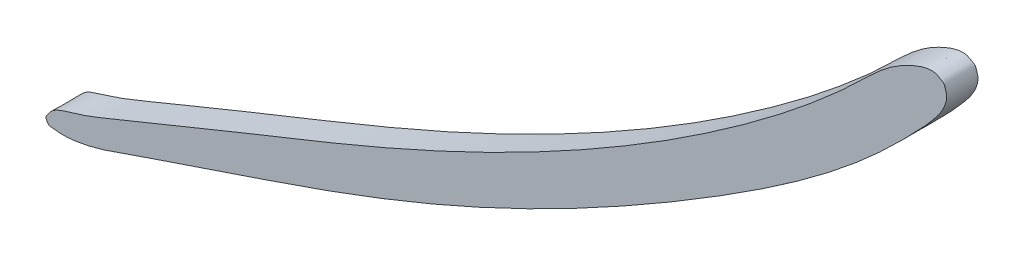
ISO-10303-21;
HEADER;
FILE_DESCRIPTION(('STEP AP214'),'2;1');
FILE_NAME('part.step','',(''),(''),'','','');
FILE_SCHEMA(('AUTOMOTIVE_DESIGN { 1 0 10303 214 1 1 1 1 }'));
ENDSEC;
DATA;
#1=APPLICATION_CONTEXT('core data for automotive mechanical design processes');
#2=APPLICATION_PROTOCOL_DEFINITION('international standard','automotive_design',2000,#1);
#3=PRODUCT_CONTEXT('',#1,'mechanical');
#4=PRODUCT('Part','Part','',(#3));
#5=PRODUCT_RELATED_PRODUCT_CATEGORY('part','',(#4));
#6=PRODUCT_DEFINITION_FORMATION('','',#4);
#7=PRODUCT_DEFINITION_CONTEXT('part definition',#1,'design');
#8=PRODUCT_DEFINITION('design','',#6,#7);
#9=PRODUCT_DEFINITION_SHAPE('','',#8);
#10=(LENGTH_UNIT() NAMED_UNIT(*) SI_UNIT(.MILLI.,.METRE.));
#11=(NAMED_UNIT(*) PLANE_ANGLE_UNIT() SI_UNIT($,.RADIAN.));
#12=(NAMED_UNIT(*) SI_UNIT($,.STERADIAN.) SOLID_ANGLE_UNIT());
#13=UNCERTAINTY_MEASURE_WITH_UNIT(LENGTH_MEASURE(1.E-05),#10,'distance_accuracy_value','');
#14=(GEOMETRIC_REPRESENTATION_CONTEXT(3) GLOBAL_UNCERTAINTY_ASSIGNED_CONTEXT((#13)) GLOBAL_UNIT_ASSIGNED_CONTEXT((#10,
#11,#12)) REPRESENTATION_CONTEXT('',''));
#15=CARTESIAN_POINT('',(0.,0.,0.));
#16=DIRECTION('',(0.,0.,1.));
#17=DIRECTION('',(1.,0.,0.));
#18=AXIS2_PLACEMENT_3D('',#15,#16,#17);
#19=CARTESIAN_POINT('',(-127.216565313246,-122.004527129022,124.));
#20=CARTESIAN_POINT('',(-127.2331790244,-122.181939963227,124.));
#21=CARTESIAN_POINT('',(-127.182469147308,-122.352573459931,124.));
#22=CARTESIAN_POINT('',(-127.078859457908,-122.593802691959,124.));
#23=CARTESIAN_POINT('',(-127.039661176353,-122.67139301166,124.));
#24=CARTESIAN_POINT('',(-126.957201757587,-122.824116421139,124.));
#25=CARTESIAN_POINT('',(-126.91446952973,-122.899569397225,124.));
#26=CARTESIAN_POINT('',(-126.822720378031,-123.046674342336,124.));
#27=CARTESIAN_POINT('',(-126.773650439979,-123.118294248175,124.));
#28=CARTESIAN_POINT('',(-126.663939295183,-123.254535714334,124.));
#29=CARTESIAN_POINT('',(-126.603437576873,-123.319542503509,124.));
#30=CARTESIAN_POINT('',(-126.468643576914,-123.430026544501,124.));
#31=CARTESIAN_POINT('',(-126.391132573455,-123.475255865362,124.));
#32=CARTESIAN_POINT('',(-126.228165070102,-123.539641522254,124.));
#33=CARTESIAN_POINT('',(-126.142567623369,-123.559850333293,124.));
#34=CARTESIAN_POINT('',(-125.880466651836,-123.598265013781,124.));
#35=CARTESIAN_POINT('',(-125.704115840545,-123.599735429816,124.));
#36=CARTESIAN_POINT('',(-125.352291933089,-123.615780600313,124.));
#37=CARTESIAN_POINT('',(-125.176695693319,-123.627952606645,124.));
#38=CARTESIAN_POINT('',(-124.650514485002,-123.671278404914,124.));
#39=CARTESIAN_POINT('',(-124.300493083938,-123.709719422813,124.));
#40=CARTESIAN_POINT('',(-123.59940095235,-123.771985311001,124.));
#41=CARTESIAN_POINT('',(-123.247940231073,-123.792267706489,124.));
#42=CARTESIAN_POINT('',(-122.54373124678,-123.80077456209,124.));
#43=CARTESIAN_POINT('',(-122.193670190687,-123.791649535432,124.));
#44=CARTESIAN_POINT('',(-121.147820612655,-123.735902273416,124.));
#45=CARTESIAN_POINT('',(-120.45606725366,-123.662861671034,124.));
#46=CARTESIAN_POINT('',(-118.389085907353,-123.389538695661,124.));
#47=CARTESIAN_POINT('',(-117.024302301626,-123.120876554657,124.));
#48=CARTESIAN_POINT('',(-114.315606457678,-122.446906626687,124.));
#49=CARTESIAN_POINT('',(-112.974062245638,-122.046134117991,124.));
#50=CARTESIAN_POINT('',(-110.311432835971,-121.199874465996,124.));
#51=CARTESIAN_POINT('',(-108.98845709117,-120.750711720899,124.));
#52=CARTESIAN_POINT('',(-106.346811305556,-119.838944501382,124.));
#53=CARTESIAN_POINT('',(-105.02841426012,-119.375754625671,124.));
#54=CARTESIAN_POINT('',(-101.074268426156,-117.983693523415,124.));
#55=CARTESIAN_POINT('',(-98.4374476155433,-117.057730973511,124.));
#56=CARTESIAN_POINT('',(-90.5108614291847,-114.326076137798,124.));
#57=CARTESIAN_POINT('',(-85.2080399946258,-112.559420360458,124.));
#58=CARTESIAN_POINT('',(-74.6062058141577,-109.015031184101,124.));
#59=CARTESIAN_POINT('',(-69.3077297740119,-107.235823313232,124.));
#60=CARTESIAN_POINT('',(-58.7459928678753,-103.57633520748,124.));
#61=CARTESIAN_POINT('',(-53.4824131532055,-101.695478713079,124.));
#62=CARTESIAN_POINT('',(-43.012705899226,-97.775116565195,124.));
#63=CARTESIAN_POINT('',(-37.8098739520248,-95.7366005902325,124.));
#64=CARTESIAN_POINT('',(-27.4787654484087,-91.4771831690793,124.));
#65=CARTESIAN_POINT('',(-22.3488338304352,-89.2566514255158,124.));
#66=CARTESIAN_POINT('',(-12.1686753502241,-84.6371709458667,124.));
#67=CARTESIAN_POINT('',(-7.12123181438755,-82.2402343534199,124.));
#68=CARTESIAN_POINT('',(2.88798194535789,-77.2711465111131,124.));
#69=CARTESIAN_POINT('',(7.8506185500004,-74.6972732524505,124.));
#70=CARTESIAN_POINT('',(17.6931781771754,-69.3974760349185,124.));
#71=CARTESIAN_POINT('',(22.5715537694292,-66.6720145371012,124.));
#72=CARTESIAN_POINT('',(32.2496130482029,-61.0824994039734,124.));
#73=CARTESIAN_POINT('',(37.0520676241476,-58.2199772756487,124.));
#74=CARTESIAN_POINT('',(46.5675774843069,-52.3556034554143,124.));
#75=CARTESIAN_POINT('',(51.2810893507214,-49.3555421042028,124.));
#76=CARTESIAN_POINT('',(58.2547226189506,-44.7072005154149,124.));
#77=CARTESIAN_POINT('',(60.5627554738731,-43.132422491118,124.));
#78=CARTESIAN_POINT('',(65.1376741312714,-39.9197416732136,124.));
#79=CARTESIAN_POINT('',(67.4045047088491,-38.2819742142157,124.));
#80=CARTESIAN_POINT('',(71.8738900241929,-34.933708311181,124.));
#81=CARTESIAN_POINT('',(74.0776598882353,-33.2223557856102,124.));
#82=CARTESIAN_POINT('',(78.4122501793552,-29.7118466698113,124.));
#83=CARTESIAN_POINT('',(80.5427347791049,-27.912285868041,124.));
#84=CARTESIAN_POINT('',(84.7241195947093,-24.2173741846859,124.));
#85=CARTESIAN_POINT('',(86.775074541103,-22.3220891783703,124.));
#86=CARTESIAN_POINT('',(90.799659942365,-18.4384491581283,124.));
#87=CARTESIAN_POINT('',(92.770778316615,-16.4521612433644,124.));
#88=CARTESIAN_POINT('',(95.6712205696775,-13.4252973752633,124.));
#89=CARTESIAN_POINT('',(96.6284362575263,-12.4075255453829,124.));
#90=CARTESIAN_POINT('',(98.0361706980892,-10.8550648097644,124.));
#91=CARTESIAN_POINT('',(98.5003639324351,-10.332937454027,124.));
#92=CARTESIAN_POINT('',(99.4069646157525,-9.26867004739853,124.));
#93=CARTESIAN_POINT('',(99.8507433149048,-8.72778964408821,124.));
#94=CARTESIAN_POINT('',(100.700671904802,-7.61146254303715,124.));
#95=CARTESIAN_POINT('',(101.107184292829,-7.03226488594217,124.));
#96=CARTESIAN_POINT('',(101.83086060959,-5.83107505622609,124.));
#97=CARTESIAN_POINT('',(102.149948531554,-5.20798622852303,124.));
#98=CARTESIAN_POINT('',(102.515845851137,-4.21403538651857,124.));
#99=CARTESIAN_POINT('',(102.620301684992,-3.87436277888177,124.));
#100=CARTESIAN_POINT('',(102.772154437626,-3.1879651777369,124.));
#101=CARTESIAN_POINT('',(102.821316205292,-2.83802838037769,124.));
#102=CARTESIAN_POINT('',(102.819633120351,-2.30373736334509,124.));
#103=CARTESIAN_POINT('',(102.805460498557,-2.1287508389671,124.));
#104=CARTESIAN_POINT('',(102.746085009468,-1.78586873062903,124.));
#105=CARTESIAN_POINT('',(102.701641143793,-1.61779970185152,124.));
#106=CARTESIAN_POINT('',(102.596112232615,-1.28546443775575,124.));
#107=CARTESIAN_POINT('',(102.535177542036,-1.12116384377281,124.));
#108=CARTESIAN_POINT('',(102.421757329489,-0.790631876651468,124.));
#109=CARTESIAN_POINT('',(102.373054033846,-0.62340705299875,124.));
#110=CARTESIAN_POINT('',(102.27609235118,-0.28849838155544,124.));
#111=CARTESIAN_POINT('',(102.22860946291,-0.116078327332698,124.));
#112=CARTESIAN_POINT('',(102.073632358173,0.0917464534884195,124.));
#113=CARTESIAN_POINT('',(102.009156196907,0.152836514322035,124.));
#114=CARTESIAN_POINT('',(101.872626568881,0.259777370626161,124.));
#115=CARTESIAN_POINT('',(101.799560512188,0.307120154566345,124.));
#116=CARTESIAN_POINT('',(101.577090121163,0.444292118598339,124.));
#117=CARTESIAN_POINT('',(101.423841419396,0.527223998225491,124.));
#118=CARTESIAN_POINT('',(101.122025404388,0.70116603215238,124.));
#119=CARTESIAN_POINT('',(100.97195936316,0.79001174954993,124.));
#120=CARTESIAN_POINT('',(100.514357947678,1.03827524442991,124.));
#121=CARTESIAN_POINT('',(100.202632730646,1.18686445214683,124.));
#122=CARTESIAN_POINT('',(99.7009840633525,1.32318528756276,124.));
#123=CARTESIAN_POINT('',(99.526497105756,1.35481000026775,124.));
#124=CARTESIAN_POINT('',(99.1762261162234,1.3908798562321,124.));
#125=CARTESIAN_POINT('',(99.0017131251448,1.39590191039572,124.));
#126=CARTESIAN_POINT('',(98.4794844552865,1.38357737166948,124.));
#127=CARTESIAN_POINT('',(98.133019401487,1.33953703746785,124.));
#128=CARTESIAN_POINT('',(97.441989111229,1.21394815916881,124.));
#129=CARTESIAN_POINT('',(97.1028242998707,1.135045931993,124.));
#130=CARTESIAN_POINT('',(96.0999388007888,0.861283304013005,124.));
#131=CARTESIAN_POINT('',(95.4517967600152,0.626907256965958,124.));
#132=CARTESIAN_POINT('',(94.1744876142412,0.11002474102525,124.));
#133=CARTESIAN_POINT('',(93.5456941359401,-0.173429441782569,124.));
#134=CARTESIAN_POINT('',(92.3054415839671,-0.784306979005777,124.));
#135=CARTESIAN_POINT('',(91.6919024255838,-1.11228150970046,124.));
#136=CARTESIAN_POINT('',(89.8911685682089,-2.14732385356199,124.));
#137=CARTESIAN_POINT('',(88.7463596627113,-2.90713669222981,124.));
#138=CARTESIAN_POINT('',(86.5640022860194,-4.56119273563587,124.));
#139=CARTESIAN_POINT('',(85.5228516049946,-5.45092126178499,124.));
#140=CARTESIAN_POINT('',(83.4913965431288,-7.29410439156414,124.));
#141=CARTESIAN_POINT('',(82.5011795369526,-8.24766850256533,124.));
#142=CARTESIAN_POINT('',(80.5276124639025,-10.1634031148936,124.));
#143=CARTESIAN_POINT('',(79.541704730762,-11.1223042295274,124.));
#144=CARTESIAN_POINT('',(77.5498680604574,-13.018481988442,124.));
#145=CARTESIAN_POINT('',(76.5441718599183,-13.9560532173929,124.));
#146=CARTESIAN_POINT('',(74.5055696614651,-15.8019272074013,124.));
#147=CARTESIAN_POINT('',(73.4724809899273,-16.7102437618997,124.));
#148=CARTESIAN_POINT('',(71.3916374538135,-18.5100168074607,124.));
#149=CARTESIAN_POINT('',(70.3456146049897,-19.4033660985128,124.));
#150=CARTESIAN_POINT('',(68.2465801142045,-21.1819077976612,124.));
#151=CARTESIAN_POINT('',(67.1918422344376,-22.0649577795943,124.));
#152=CARTESIAN_POINT('',(65.0641795011014,-23.808946794464,124.));
#153=CARTESIAN_POINT('',(63.9922373030388,-24.6713440006102,124.));
#154=CARTESIAN_POINT('',(60.7626909380215,-27.2377189420902,124.));
#155=CARTESIAN_POINT('',(58.5888277363476,-28.9190622715911,124.));
#156=CARTESIAN_POINT('',(54.1971316189809,-32.2193299954407,124.));
#157=CARTESIAN_POINT('',(51.9808688292023,-33.8404833237225,124.));
#158=CARTESIAN_POINT('',(47.5144085397289,-37.0346166294936,124.));
#159=CARTESIAN_POINT('',(45.2642914421221,-38.6077107449262,124.));
#160=CARTESIAN_POINT('',(40.7350529378078,-41.7127247691969,124.));
#161=CARTESIAN_POINT('',(38.4555858790025,-43.2441539940185,124.));
#162=CARTESIAN_POINT('',(31.5662691271385,-47.7661624628292,124.));
#163=CARTESIAN_POINT('',(26.9043957746706,-50.6875232446003,124.));
#164=CARTESIAN_POINT('',(17.4791676457685,-56.3525723388485,124.));
#165=CARTESIAN_POINT('',(12.7152558236222,-59.0990141023844,124.));
#166=CARTESIAN_POINT('',(5.49851268976491,-63.0945328127547,124.));
#167=CARTESIAN_POINT('',(3.08230731947385,-64.4051598084291,124.));
#168=CARTESIAN_POINT('',(-1.76834305567287,-66.9899964667568,124.));
#169=CARTESIAN_POINT('',(-4.20296695138389,-68.2638489551567,124.));
#170=CARTESIAN_POINT('',(-11.5375645366976,-72.0240589595585,124.));
#171=CARTESIAN_POINT('',(-16.4681255687527,-74.4493456557267,124.));
#172=CARTESIAN_POINT('',(-26.4010754523665,-79.1565073139194,124.));
#173=CARTESIAN_POINT('',(-31.4041587256388,-81.4406801442739,124.));
#174=CARTESIAN_POINT('',(-41.4646774993177,-85.8785122386931,124.));
#175=CARTESIAN_POINT('',(-46.5256229121369,-88.0240075534367,124.));
#176=CARTESIAN_POINT('',(-56.6826904291485,-92.2308328873566,124.));
#177=CARTESIAN_POINT('',(-61.7782407262233,-94.2935310373376,124.));
#178=CARTESIAN_POINT('',(-71.9805661366423,-98.3920703492736,124.));
#179=CARTESIAN_POINT('',(-77.0867982498595,-100.429067078028,124.));
#180=CARTESIAN_POINT('',(-87.2849829255183,-104.538198502922,124.));
#181=CARTESIAN_POINT('',(-92.3751813245651,-106.614845156096,124.));
#182=CARTESIAN_POINT('',(-100.002017270502,-109.750480371471,124.));
#183=CARTESIAN_POINT('',(-102.542862434301,-110.799180336716,124.));
#184=CARTESIAN_POINT('',(-106.356353641753,-112.366818146065,124.));
#185=CARTESIAN_POINT('',(-107.627982925678,-112.888229357319,124.));
#186=CARTESIAN_POINT('',(-110.172236508613,-113.928626533822,124.));
#187=CARTESIAN_POINT('',(-111.443726217542,-114.450530063424,124.));
#188=CARTESIAN_POINT('',(-113.99375741762,-115.475616893063,124.));
#189=CARTESIAN_POINT('',(-115.273760899631,-115.974929310715,124.));
#190=CARTESIAN_POINT('',(-117.214176224463,-116.669757522304,124.));
#191=CARTESIAN_POINT('',(-117.864226502465,-116.892758696927,124.));
#192=CARTESIAN_POINT('',(-119.172260827885,-117.317715704425,124.));
#193=CARTESIAN_POINT('',(-119.831065405089,-117.517561557482,124.));
#194=CARTESIAN_POINT('',(-121.153967725264,-117.902295422583,124.));
#195=CARTESIAN_POINT('',(-121.816529189419,-118.091569724319,124.));
#196=CARTESIAN_POINT('',(-122.796426830967,-118.414322212263,124.));
#197=CARTESIAN_POINT('',(-123.120970402509,-118.527724988595,124.));
#198=CARTESIAN_POINT('',(-123.762702495688,-118.775017230127,124.));
#199=CARTESIAN_POINT('',(-124.079819257743,-118.909106573816,124.));
#200=CARTESIAN_POINT('',(-124.700385627992,-119.215353626812,124.));
#201=CARTESIAN_POINT('',(-125.006779964206,-119.390609284952,124.));
#202=CARTESIAN_POINT('',(-125.574576031791,-119.79138042453,124.));
#203=CARTESIAN_POINT('',(-125.833471576103,-120.020405409056,124.));
#204=CARTESIAN_POINT('',(-126.307738340015,-120.528310861005,124.));
#205=CARTESIAN_POINT('',(-126.525011538035,-120.805059417916,124.));
#206=CARTESIAN_POINT('',(-126.832750848314,-121.229250060561,124.));
#207=CARTESIAN_POINT('',(-126.935454715976,-121.370558267732,124.));
#208=CARTESIAN_POINT('',(-127.119444707433,-121.668478695203,124.));
#209=CARTESIAN_POINT('',(-127.199951602091,-121.827114294816,124.));
#210=CARTESIAN_POINT('',(-127.216565313246,-122.004527129022,124.));
#211=B_SPLINE_CURVE_WITH_KNOTS('',3,(#19,#20,#21,#22,#23,#24,#25,#26,#27,#28,#29,#30,#31,#32,
#33,#34,#35,#36,#37,#38,#39,#40,#41,#42,#43,#44,#45,#46,#47,#48,#49,#50,#51,#52,#53,#54,#55,#56,
#57,#58,#59,#60,#61,#62,#63,#64,#65,#66,#67,#68,#69,#70,#71,#72,#73,#74,#75,#76,#77,#78,#79,#80,
#81,#82,#83,#84,#85,#86,#87,#88,#89,#90,#91,#92,#93,#94,#95,#96,#97,#98,#99,#100,#101,#102,#103,
#104,#105,#106,#107,#108,#109,#110,#111,#112,#113,#114,#115,#116,#117,#118,#119,#120,#121,#122,
#123,#124,#125,#126,#127,#128,#129,#130,#131,#132,#133,#134,#135,#136,#137,#138,#139,#140,#141,
#142,#143,#144,#145,#146,#147,#148,#149,#150,#151,#152,#153,#154,#155,#156,#157,#158,#159,#160,
#161,#162,#163,#164,#165,#166,#167,#168,#169,#170,#171,#172,#173,#174,#175,#176,#177,#178,#179,
#180,#181,#182,#183,#184,#185,#186,#187,#188,#189,#190,#191,#192,#193,#194,#195,#196,#197,#198,
#199,#200,#201,#202,#203,#204,#205,#206,#207,#208,#209,#210),.UNSPECIFIED.,.T.,.F.,(4,2,2,2,2,2,
2,2,2,2,2,2,2,2,2,2,2,2,2,2,2,2,2,2,2,2,2,2,2,2,2,2,2,2,2,2,2,2,2,2,2,2,2,2,2,2,2,2,2,2,2,2,2,2,
2,2,2,2,2,2,2,2,2,2,2,2,2,2,2,2,2,2,2,2,2,2,2,2,2,2,2,2,2,2,2,2,2,2,2,2,2,2,2,2,2,4),(0.,
0.000976562499999889,0.00146484374999978,0.00195312499999978,0.00244140624999967,
0.00292968749999967,0.00341796874999956,0.00390624999999944,0.00488281249999944,
0.00585937499999944,0.00781249999999944,0.00976562499999944,0.0117187499999993,
0.0156249999999993,0.0234374999999992,0.0312499999999991,0.039062499999999,0.0468749999999989,
0.0624999999999988,0.0937499999999986,0.124999999999998,0.156249999999998,0.187499999999998,
0.218749999999998,0.249999999999997,0.281249999999997,0.312499999999997,0.343749999999997,
0.374999999999996,0.390624999999996,0.406249999999996,0.421874999999996,0.437499999999996,
0.453124999999995,0.468749999999995,0.476562499999995,0.480468749999995,0.484374999999995,
0.488281249999995,0.492187499999995,0.494140624999995,0.496093749999995,0.497070312499995,
0.498046874999995,0.499023437499995,0.499999999999995,0.500976562499995,0.501464843749995,
0.501953124999995,0.502929687499995,0.503906249999995,0.505859374999995,0.506835937499994,
0.507812499999994,0.509765624999994,0.511718749999994,0.515624999999994,0.519531249999994,
0.523437499999994,0.531249999999994,0.539062499999994,0.546874999999995,0.554687499999995,
0.562499999999995,0.570312499999995,0.578124999999995,0.585937499999995,0.593749999999995,
0.609374999999995,0.624999999999995,0.640624999999995,0.656249999999996,0.687499999999996,
0.718749999999996,0.734374999999996,0.749999999999997,0.781249999999997,0.812499999999997,
0.843749999999998,0.874999999999998,0.906249999999998,0.937499999999999,0.953124999999999,
0.960937499999999,0.968749999999999,0.976562499999999,0.980468749999999,0.984375,0.98828125,
0.990234375,0.9921875,0.994140625,0.99609375,0.998046875,0.9990234375,1.),.UNSPECIFIED.);
#212=DIRECTION('',(0.,0.,-1.));
#213=VECTOR('',#212,1.);
#214=SURFACE_OF_LINEAR_EXTRUSION('',#211,#213);
#215=CARTESIAN_POINT('',(-127.216565313246,-122.004527129022,124.));
#216=CARTESIAN_POINT('',(-127.199951602091,-121.827114294816,124.));
#217=CARTESIAN_POINT('',(-127.119444707433,-121.668478695203,124.));
#218=CARTESIAN_POINT('',(-126.935454715976,-121.370558267732,124.));
#219=CARTESIAN_POINT('',(-126.832750848314,-121.229250060561,124.));
#220=CARTESIAN_POINT('',(-126.525011538035,-120.805059417916,124.));
#221=CARTESIAN_POINT('',(-126.307738340015,-120.528310861005,124.));
#222=CARTESIAN_POINT('',(-125.833471576103,-120.020405409056,124.));
#223=CARTESIAN_POINT('',(-125.574576031791,-119.79138042453,124.));
#224=CARTESIAN_POINT('',(-125.006779964206,-119.390609284952,124.));
#225=CARTESIAN_POINT('',(-124.700385627992,-119.215353626812,124.));
#226=CARTESIAN_POINT('',(-124.079819257743,-118.909106573816,124.));
#227=CARTESIAN_POINT('',(-123.762702495688,-118.775017230127,124.));
#228=CARTESIAN_POINT('',(-123.120970402509,-118.527724988595,124.));
#229=CARTESIAN_POINT('',(-122.796426830967,-118.414322212263,124.));
#230=CARTESIAN_POINT('',(-121.816529189419,-118.091569724319,124.));
#231=CARTESIAN_POINT('',(-121.153967725264,-117.902295422583,124.));
#232=CARTESIAN_POINT('',(-119.831065405089,-117.517561557482,124.));
#233=CARTESIAN_POINT('',(-119.172260827885,-117.317715704425,124.));
#234=CARTESIAN_POINT('',(-117.864226502465,-116.892758696927,124.));
#235=CARTESIAN_POINT('',(-117.214176224463,-116.669757522304,124.));
#236=CARTESIAN_POINT('',(-115.273760899631,-115.974929310715,124.));
#237=CARTESIAN_POINT('',(-113.99375741762,-115.475616893063,124.));
#238=CARTESIAN_POINT('',(-111.443726217542,-114.450530063424,124.));
#239=CARTESIAN_POINT('',(-110.172236508613,-113.928626533822,124.));
#240=CARTESIAN_POINT('',(-107.627982925678,-112.888229357319,124.));
#241=CARTESIAN_POINT('',(-106.356353641753,-112.366818146065,124.));
#242=CARTESIAN_POINT('',(-102.542862434301,-110.799180336716,124.));
#243=CARTESIAN_POINT('',(-100.002017270502,-109.750480371471,124.));
#244=CARTESIAN_POINT('',(-92.3751813245651,-106.614845156096,124.));
#245=CARTESIAN_POINT('',(-87.2849829255183,-104.538198502922,124.));
#246=CARTESIAN_POINT('',(-77.0867982498595,-100.429067078028,124.));
#247=CARTESIAN_POINT('',(-71.9805661366423,-98.3920703492736,124.));
#248=CARTESIAN_POINT('',(-61.7782407262233,-94.2935310373376,124.));
#249=CARTESIAN_POINT('',(-56.6826904291485,-92.2308328873566,124.));
#250=CARTESIAN_POINT('',(-46.5256229121369,-88.0240075534367,124.));
#251=CARTESIAN_POINT('',(-41.4646774993177,-85.8785122386931,124.));
#252=CARTESIAN_POINT('',(-31.4041587256388,-81.4406801442739,124.));
#253=CARTESIAN_POINT('',(-26.4010754523665,-79.1565073139194,124.));
#254=CARTESIAN_POINT('',(-16.4681255687527,-74.4493456557267,124.));
#255=CARTESIAN_POINT('',(-11.5375645366976,-72.0240589595585,124.));
#256=CARTESIAN_POINT('',(-4.20296695138389,-68.2638489551567,124.));
#257=CARTESIAN_POINT('',(-1.76834305567287,-66.9899964667568,124.));
#258=CARTESIAN_POINT('',(3.08230731947385,-64.4051598084291,124.));
#259=CARTESIAN_POINT('',(5.49851268976491,-63.0945328127547,124.));
#260=CARTESIAN_POINT('',(12.7152558236222,-59.0990141023844,124.));
#261=CARTESIAN_POINT('',(17.4791676457685,-56.3525723388485,124.));
#262=CARTESIAN_POINT('',(26.9043957746706,-50.6875232446003,124.));
#263=CARTESIAN_POINT('',(31.5662691271385,-47.7661624628292,124.));
#264=CARTESIAN_POINT('',(38.4555858790025,-43.2441539940185,124.));
#265=CARTESIAN_POINT('',(40.7350529378078,-41.7127247691969,124.));
#266=CARTESIAN_POINT('',(45.2642914421221,-38.6077107449262,124.));
#267=CARTESIAN_POINT('',(47.5144085397289,-37.0346166294936,124.));
#268=CARTESIAN_POINT('',(51.9808688292023,-33.8404833237225,124.));
#269=CARTESIAN_POINT('',(54.1971316189809,-32.2193299954407,124.));
#270=CARTESIAN_POINT('',(58.5888277363476,-28.9190622715911,124.));
#271=CARTESIAN_POINT('',(60.7626909380215,-27.2377189420902,124.));
#272=CARTESIAN_POINT('',(63.9922373030388,-24.6713440006102,124.));
#273=CARTESIAN_POINT('',(65.0641795011014,-23.808946794464,124.));
#274=CARTESIAN_POINT('',(67.1918422344376,-22.0649577795943,124.));
#275=CARTESIAN_POINT('',(68.2465801142045,-21.1819077976612,124.));
#276=CARTESIAN_POINT('',(70.3456146049897,-19.4033660985128,124.));
#277=CARTESIAN_POINT('',(71.3916374538135,-18.5100168074607,124.));
#278=CARTESIAN_POINT('',(73.4724809899273,-16.7102437618997,124.));
#279=CARTESIAN_POINT('',(74.5055696614651,-15.8019272074013,124.));
#280=CARTESIAN_POINT('',(76.5441718599183,-13.9560532173929,124.));
#281=CARTESIAN_POINT('',(77.5498680604574,-13.018481988442,124.));
#282=CARTESIAN_POINT('',(79.541704730762,-11.1223042295274,124.));
#283=CARTESIAN_POINT('',(80.5276124639025,-10.1634031148936,124.));
#284=CARTESIAN_POINT('',(82.5011795369526,-8.24766850256533,124.));
#285=CARTESIAN_POINT('',(83.4913965431288,-7.29410439156414,124.));
#286=CARTESIAN_POINT('',(85.5228516049946,-5.45092126178499,124.));
#287=CARTESIAN_POINT('',(86.5640022860194,-4.56119273563587,124.));
#288=CARTESIAN_POINT('',(88.7463596627113,-2.90713669222981,124.));
#289=CARTESIAN_POINT('',(89.8911685682089,-2.14732385356199,124.));
#290=CARTESIAN_POINT('',(91.6919024255838,-1.11228150970046,124.));
#291=CARTESIAN_POINT('',(92.3054415839671,-0.784306979005777,124.));
#292=CARTESIAN_POINT('',(93.5456941359401,-0.173429441782569,124.));
#293=CARTESIAN_POINT('',(94.1744876142412,0.11002474102525,124.));
#294=CARTESIAN_POINT('',(95.4517967600152,0.626907256965958,124.));
#295=CARTESIAN_POINT('',(96.0999388007888,0.861283304013005,124.));
#296=CARTESIAN_POINT('',(97.1028242998707,1.135045931993,124.));
#297=CARTESIAN_POINT('',(97.441989111229,1.21394815916881,124.));
#298=CARTESIAN_POINT('',(98.133019401487,1.33953703746785,124.));
#299=CARTESIAN_POINT('',(98.4794844552865,1.38357737166948,124.));
#300=CARTESIAN_POINT('',(99.0017131251448,1.39590191039572,124.));
#301=CARTESIAN_POINT('',(99.1762261162234,1.3908798562321,124.));
#302=CARTESIAN_POINT('',(99.526497105756,1.35481000026775,124.));
#303=CARTESIAN_POINT('',(99.7009840633525,1.32318528756276,124.));
#304=CARTESIAN_POINT('',(100.202632730646,1.18686445214683,124.));
#305=CARTESIAN_POINT('',(100.514357947678,1.03827524442991,124.));
#306=CARTESIAN_POINT('',(100.97195936316,0.79001174954993,124.));
#307=CARTESIAN_POINT('',(101.122025404388,0.70116603215238,124.));
#308=CARTESIAN_POINT('',(101.423841419396,0.527223998225491,124.));
#309=CARTESIAN_POINT('',(101.577090121163,0.444292118598339,124.));
#310=CARTESIAN_POINT('',(101.799560512188,0.307120154566345,124.));
#311=CARTESIAN_POINT('',(101.872626568881,0.259777370626161,124.));
#312=CARTESIAN_POINT('',(102.009156196907,0.152836514322035,124.));
#313=CARTESIAN_POINT('',(102.073632358173,0.0917464534884195,124.));
#314=CARTESIAN_POINT('',(102.22860946291,-0.116078327332698,124.));
#315=CARTESIAN_POINT('',(102.27609235118,-0.28849838155544,124.));
#316=CARTESIAN_POINT('',(102.373054033846,-0.62340705299875,124.));
#317=CARTESIAN_POINT('',(102.421757329489,-0.790631876651468,124.));
#318=CARTESIAN_POINT('',(102.535177542036,-1.12116384377281,124.));
#319=CARTESIAN_POINT('',(102.596112232615,-1.28546443775575,124.));
#320=CARTESIAN_POINT('',(102.701641143793,-1.61779970185152,124.));
#321=CARTESIAN_POINT('',(102.746085009468,-1.78586873062903,124.));
#322=CARTESIAN_POINT('',(102.805460498557,-2.1287508389671,124.));
#323=CARTESIAN_POINT('',(102.819633120351,-2.30373736334509,124.));
#324=CARTESIAN_POINT('',(102.821316205292,-2.83802838037769,124.));
#325=CARTESIAN_POINT('',(102.772154437626,-3.1879651777369,124.));
#326=CARTESIAN_POINT('',(102.620301684992,-3.87436277888177,124.));
#327=CARTESIAN_POINT('',(102.515845851137,-4.21403538651857,124.));
#328=CARTESIAN_POINT('',(102.149948531554,-5.20798622852303,124.));
#329=CARTESIAN_POINT('',(101.83086060959,-5.83107505622609,124.));
#330=CARTESIAN_POINT('',(101.107184292829,-7.03226488594217,124.));
#331=CARTESIAN_POINT('',(100.700671904802,-7.61146254303715,124.));
#332=CARTESIAN_POINT('',(99.8507433149048,-8.72778964408821,124.));
#333=CARTESIAN_POINT('',(99.4069646157525,-9.26867004739853,124.));
#334=CARTESIAN_POINT('',(98.5003639324351,-10.332937454027,124.));
#335=CARTESIAN_POINT('',(98.0361706980892,-10.8550648097644,124.));
#336=CARTESIAN_POINT('',(96.6284362575263,-12.4075255453829,124.));
#337=CARTESIAN_POINT('',(95.6712205696775,-13.4252973752633,124.));
#338=CARTESIAN_POINT('',(92.770778316615,-16.4521612433644,124.));
#339=CARTESIAN_POINT('',(90.799659942365,-18.4384491581283,124.));
#340=CARTESIAN_POINT('',(86.775074541103,-22.3220891783703,124.));
#341=CARTESIAN_POINT('',(84.7241195947093,-24.2173741846859,124.));
#342=CARTESIAN_POINT('',(80.5427347791049,-27.912285868041,124.));
#343=CARTESIAN_POINT('',(78.4122501793552,-29.7118466698113,124.));
#344=CARTESIAN_POINT('',(74.0776598882353,-33.2223557856102,124.));
#345=CARTESIAN_POINT('',(71.8738900241929,-34.933708311181,124.));
#346=CARTESIAN_POINT('',(67.4045047088491,-38.2819742142157,124.));
#347=CARTESIAN_POINT('',(65.1376741312714,-39.9197416732136,124.));
#348=CARTESIAN_POINT('',(60.5627554738731,-43.132422491118,124.));
#349=CARTESIAN_POINT('',(58.2547226189506,-44.7072005154149,124.));
#350=CARTESIAN_POINT('',(51.2810893507214,-49.3555421042028,124.));
#351=CARTESIAN_POINT('',(46.5675774843069,-52.3556034554143,124.));
#352=CARTESIAN_POINT('',(37.0520676241476,-58.2199772756487,124.));
#353=CARTESIAN_POINT('',(32.2496130482029,-61.0824994039734,124.));
#354=CARTESIAN_POINT('',(22.5715537694292,-66.6720145371012,124.));
#355=CARTESIAN_POINT('',(17.6931781771754,-69.3974760349185,124.));
#356=CARTESIAN_POINT('',(7.8506185500004,-74.6972732524505,124.));
#357=CARTESIAN_POINT('',(2.88798194535789,-77.2711465111131,124.));
#358=CARTESIAN_POINT('',(-7.12123181438755,-82.2402343534199,124.));
#359=CARTESIAN_POINT('',(-12.1686753502241,-84.6371709458667,124.));
#360=CARTESIAN_POINT('',(-22.3488338304352,-89.2566514255158,124.));
#361=CARTESIAN_POINT('',(-27.4787654484087,-91.4771831690793,124.));
#362=CARTESIAN_POINT('',(-37.8098739520248,-95.7366005902325,124.));
#363=CARTESIAN_POINT('',(-43.012705899226,-97.775116565195,124.));
#364=CARTESIAN_POINT('',(-53.4824131532055,-101.695478713079,124.));
#365=CARTESIAN_POINT('',(-58.7459928678753,-103.57633520748,124.));
#366=CARTESIAN_POINT('',(-69.3077297740119,-107.235823313232,124.));
#367=CARTESIAN_POINT('',(-74.6062058141577,-109.015031184101,124.));
#368=CARTESIAN_POINT('',(-85.2080399946258,-112.559420360458,124.));
#369=CARTESIAN_POINT('',(-90.5108614291847,-114.326076137798,124.));
#370=CARTESIAN_POINT('',(-98.4374476155433,-117.057730973511,124.));
#371=CARTESIAN_POINT('',(-101.074268426156,-117.983693523415,124.));
#372=CARTESIAN_POINT('',(-105.02841426012,-119.375754625671,124.));
#373=CARTESIAN_POINT('',(-106.346811305556,-119.838944501382,124.));
#374=CARTESIAN_POINT('',(-108.98845709117,-120.750711720899,124.));
#375=CARTESIAN_POINT('',(-110.311432835971,-121.199874465996,124.));
#376=CARTESIAN_POINT('',(-112.974062245638,-122.046134117991,124.));
#377=CARTESIAN_POINT('',(-114.315606457678,-122.446906626687,124.));
#378=CARTESIAN_POINT('',(-117.024302301626,-123.120876554657,124.));
#379=CARTESIAN_POINT('',(-118.389085907353,-123.389538695661,124.));
#380=CARTESIAN_POINT('',(-120.45606725366,-123.662861671034,124.));
#381=CARTESIAN_POINT('',(-121.147820612655,-123.735902273416,124.));
#382=CARTESIAN_POINT('',(-122.193670190687,-123.791649535432,124.));
#383=CARTESIAN_POINT('',(-122.54373124678,-123.80077456209,124.));
#384=CARTESIAN_POINT('',(-123.247940231073,-123.792267706489,124.));
#385=CARTESIAN_POINT('',(-123.59940095235,-123.771985311001,124.));
#386=CARTESIAN_POINT('',(-124.300493083938,-123.709719422813,124.));
#387=CARTESIAN_POINT('',(-124.650514485002,-123.671278404914,124.));
#388=CARTESIAN_POINT('',(-125.176695693319,-123.627952606645,124.));
#389=CARTESIAN_POINT('',(-125.352291933089,-123.615780600313,124.));
#390=CARTESIAN_POINT('',(-125.704115840545,-123.599735429816,124.));
#391=CARTESIAN_POINT('',(-125.880466651836,-123.598265013781,124.));
#392=CARTESIAN_POINT('',(-126.142567623369,-123.559850333293,124.));
#393=CARTESIAN_POINT('',(-126.228165070102,-123.539641522254,124.));
#394=CARTESIAN_POINT('',(-126.391132573455,-123.475255865362,124.));
#395=CARTESIAN_POINT('',(-126.468643576914,-123.430026544501,124.));
#396=CARTESIAN_POINT('',(-126.603437576873,-123.319542503509,124.));
#397=CARTESIAN_POINT('',(-126.663939295183,-123.254535714334,124.));
#398=CARTESIAN_POINT('',(-126.773650439979,-123.118294248175,124.));
#399=CARTESIAN_POINT('',(-126.822720378031,-123.046674342336,124.));
#400=CARTESIAN_POINT('',(-126.91446952973,-122.899569397225,124.));
#401=CARTESIAN_POINT('',(-126.957201757587,-122.824116421139,124.));
#402=CARTESIAN_POINT('',(-127.039661176353,-122.67139301166,124.));
#403=CARTESIAN_POINT('',(-127.078859457908,-122.593802691959,124.));
#404=CARTESIAN_POINT('',(-127.182469147308,-122.352573459931,124.));
#405=CARTESIAN_POINT('',(-127.2331790244,-122.181939963227,124.));
#406=CARTESIAN_POINT('',(-127.216565313246,-122.004527129022,124.));
#407=B_SPLINE_CURVE_WITH_KNOTS('',3,(#215,#216,#217,#218,#219,#220,#221,#222,#223,#224,#225,
#226,#227,#228,#229,#230,#231,#232,#233,#234,#235,#236,#237,#238,#239,#240,#241,#242,#243,#244,
#245,#246,#247,#248,#249,#250,#251,#252,#253,#254,#255,#256,#257,#258,#259,#260,#261,#262,#263,
#264,#265,#266,#267,#268,#269,#270,#271,#272,#273,#274,#275,#276,#277,#278,#279,#280,#281,#282,
#283,#284,#285,#286,#287,#288,#289,#290,#291,#292,#293,#294,#295,#296,#297,#298,#299,#300,#301,
#302,#303,#304,#305,#306,#307,#308,#309,#310,#311,#312,#313,#314,#315,#316,#317,#318,#319,#320,
#321,#322,#323,#324,#325,#326,#327,#328,#329,#330,#331,#332,#333,#334,#335,#336,#337,#338,#339,
#340,#341,#342,#343,#344,#345,#346,#347,#348,#349,#350,#351,#352,#353,#354,#355,#356,#357,#358,
#359,#360,#361,#362,#363,#364,#365,#366,#367,#368,#369,#370,#371,#372,#373,#374,#375,#376,#377,
#378,#379,#380,#381,#382,#383,#384,#385,#386,#387,#388,#389,#390,#391,#392,#393,#394,#395,#396,
#397,#398,#399,#400,#401,#402,#403,#404,#405,#406),.UNSPECIFIED.,.T.,.F.,(4,2,2,2,2,2,2,2,2,2,2,
2,2,2,2,2,2,2,2,2,2,2,2,2,2,2,2,2,2,2,2,2,2,2,2,2,2,2,2,2,2,2,2,2,2,2,2,2,2,2,2,2,2,2,2,2,2,2,2,
2,2,2,2,2,2,2,2,2,2,2,2,2,2,2,2,2,2,2,2,2,2,2,2,2,2,2,2,2,2,2,2,2,2,2,2,4),(0.,
0.000976562500000111,0.00195312500000022,0.00390625000000022,0.00585937500000022,
0.00781250000000033,0.00976562500000033,0.0117187500000004,0.0156250000000004,
0.0195312500000006,0.0234375000000007,0.0312500000000008,0.0390625000000009,0.046875000000001,
0.0625000000000012,0.0937500000000016,0.125000000000002,0.156250000000002,0.187500000000003,
0.218750000000003,0.250000000000003,0.265625000000004,0.281250000000004,0.312500000000004,
0.343750000000004,0.359375000000005,0.375000000000005,0.390625000000005,0.406250000000005,
0.414062500000005,0.421875000000005,0.429687500000005,0.437500000000005,0.445312500000005,
0.453125000000005,0.460937500000006,0.468750000000006,0.476562500000006,0.480468750000006,
0.484375000000006,0.488281250000006,0.490234375000006,0.492187500000006,0.493164062500006,
0.494140625000005,0.496093750000005,0.497070312500005,0.498046875000005,0.498535156250005,
0.499023437500005,0.500000000000005,0.500976562500005,0.501953125000005,0.502929687500005,
0.503906250000005,0.505859375000005,0.507812500000005,0.511718750000005,0.515625000000005,
0.519531250000005,0.523437500000005,0.531250000000005,0.546875000000005,0.562500000000004,
0.578125000000004,0.593750000000004,0.609375000000004,0.625000000000004,0.656250000000003,
0.687500000000003,0.718750000000003,0.750000000000003,0.781250000000002,0.812500000000002,
0.843750000000002,0.875000000000002,0.906250000000001,0.937500000000001,0.953125000000001,
0.960937500000001,0.968750000000001,0.976562500000001,0.984375000000001,0.988281250000001,
0.990234375000001,0.992187500000001,0.994140625000001,0.995117187500001,0.996093750000001,
0.99658203125,0.9970703125,0.99755859375,0.998046875,0.99853515625,0.9990234375,1.),.UNSPECIFIED.);
#408=CARTESIAN_POINT('',(-127.216565313246,-122.004527129022,124.));
#409=VERTEX_POINT('',#408);
#410=EDGE_CURVE('E10',#409,#409,#407,.F.);
#411=ORIENTED_EDGE('',*,*,#410,.F.);
#412=EDGE_LOOP('',(#411));
#413=FACE_BOUND('',#412,.T.);
#414=CARTESIAN_POINT('',(-127.216565313246,-122.004527129022,116.));
#415=CARTESIAN_POINT('',(-127.2331790244,-122.181939963227,116.));
#416=CARTESIAN_POINT('',(-127.182469147308,-122.352573459931,116.));
#417=CARTESIAN_POINT('',(-127.078859457908,-122.593802691959,116.));
#418=CARTESIAN_POINT('',(-127.039661176353,-122.67139301166,116.));
#419=CARTESIAN_POINT('',(-126.957201757587,-122.824116421139,116.));
#420=CARTESIAN_POINT('',(-126.91446952973,-122.899569397225,116.));
#421=CARTESIAN_POINT('',(-126.822720378031,-123.046674342336,116.));
#422=CARTESIAN_POINT('',(-126.773650439979,-123.118294248175,116.));
#423=CARTESIAN_POINT('',(-126.663939295183,-123.254535714334,116.));
#424=CARTESIAN_POINT('',(-126.603437576873,-123.319542503509,116.));
#425=CARTESIAN_POINT('',(-126.468643576914,-123.430026544501,116.));
#426=CARTESIAN_POINT('',(-126.391132573455,-123.475255865362,116.));
#427=CARTESIAN_POINT('',(-126.228165070102,-123.539641522254,116.));
#428=CARTESIAN_POINT('',(-126.142567623369,-123.559850333293,116.));
#429=CARTESIAN_POINT('',(-125.880466651836,-123.598265013781,116.));
#430=CARTESIAN_POINT('',(-125.704115840545,-123.599735429816,116.));
#431=CARTESIAN_POINT('',(-125.352291933089,-123.615780600313,116.));
#432=CARTESIAN_POINT('',(-125.176695693319,-123.627952606645,116.));
#433=CARTESIAN_POINT('',(-124.650514485002,-123.671278404914,116.));
#434=CARTESIAN_POINT('',(-124.300493083938,-123.709719422813,116.));
#435=CARTESIAN_POINT('',(-123.59940095235,-123.771985311001,116.));
#436=CARTESIAN_POINT('',(-123.247940231073,-123.792267706489,116.));
#437=CARTESIAN_POINT('',(-122.54373124678,-123.80077456209,116.));
#438=CARTESIAN_POINT('',(-122.193670190687,-123.791649535432,116.));
#439=CARTESIAN_POINT('',(-121.147820612655,-123.735902273416,116.));
#440=CARTESIAN_POINT('',(-120.45606725366,-123.662861671034,116.));
#441=CARTESIAN_POINT('',(-118.389085907353,-123.389538695661,116.));
#442=CARTESIAN_POINT('',(-117.024302301626,-123.120876554657,116.));
#443=CARTESIAN_POINT('',(-114.315606457678,-122.446906626687,116.));
#444=CARTESIAN_POINT('',(-112.974062245638,-122.046134117991,116.));
#445=CARTESIAN_POINT('',(-110.311432835971,-121.199874465996,116.));
#446=CARTESIAN_POINT('',(-108.98845709117,-120.750711720899,116.));
#447=CARTESIAN_POINT('',(-106.346811305556,-119.838944501382,116.));
#448=CARTESIAN_POINT('',(-105.02841426012,-119.375754625671,116.));
#449=CARTESIAN_POINT('',(-101.074268426156,-117.983693523415,116.));
#450=CARTESIAN_POINT('',(-98.4374476155433,-117.057730973511,116.));
#451=CARTESIAN_POINT('',(-90.5108614291847,-114.326076137798,116.));
#452=CARTESIAN_POINT('',(-85.2080399946258,-112.559420360458,116.));
#453=CARTESIAN_POINT('',(-74.6062058141577,-109.015031184101,116.));
#454=CARTESIAN_POINT('',(-69.3077297740119,-107.235823313232,116.));
#455=CARTESIAN_POINT('',(-58.7459928678753,-103.57633520748,116.));
#456=CARTESIAN_POINT('',(-53.4824131532055,-101.695478713079,116.));
#457=CARTESIAN_POINT('',(-43.012705899226,-97.775116565195,116.));
#458=CARTESIAN_POINT('',(-37.8098739520248,-95.7366005902325,116.));
#459=CARTESIAN_POINT('',(-27.4787654484087,-91.4771831690793,116.));
#460=CARTESIAN_POINT('',(-22.3488338304352,-89.2566514255158,116.));
#461=CARTESIAN_POINT('',(-12.1686753502241,-84.6371709458667,116.));
#462=CARTESIAN_POINT('',(-7.12123181438755,-82.2402343534199,116.));
#463=CARTESIAN_POINT('',(2.88798194535789,-77.2711465111131,116.));
#464=CARTESIAN_POINT('',(7.8506185500004,-74.6972732524505,116.));
#465=CARTESIAN_POINT('',(17.6931781771754,-69.3974760349185,116.));
#466=CARTESIAN_POINT('',(22.5715537694292,-66.6720145371012,116.));
#467=CARTESIAN_POINT('',(32.2496130482029,-61.0824994039734,116.));
#468=CARTESIAN_POINT('',(37.0520676241476,-58.2199772756487,116.));
#469=CARTESIAN_POINT('',(46.5675774843069,-52.3556034554143,116.));
#470=CARTESIAN_POINT('',(51.2810893507214,-49.3555421042028,116.));
#471=CARTESIAN_POINT('',(58.2547226189506,-44.7072005154149,116.));
#472=CARTESIAN_POINT('',(60.5627554738731,-43.132422491118,116.));
#473=CARTESIAN_POINT('',(65.1376741312714,-39.9197416732136,116.));
#474=CARTESIAN_POINT('',(67.4045047088491,-38.2819742142157,116.));
#475=CARTESIAN_POINT('',(71.8738900241929,-34.933708311181,116.));
#476=CARTESIAN_POINT('',(74.0776598882353,-33.2223557856102,116.));
#477=CARTESIAN_POINT('',(78.4122501793552,-29.7118466698113,116.));
#478=CARTESIAN_POINT('',(80.5427347791049,-27.912285868041,116.));
#479=CARTESIAN_POINT('',(84.7241195947093,-24.2173741846859,116.));
#480=CARTESIAN_POINT('',(86.775074541103,-22.3220891783703,116.));
#481=CARTESIAN_POINT('',(90.799659942365,-18.4384491581283,116.));
#482=CARTESIAN_POINT('',(92.770778316615,-16.4521612433644,116.));
#483=CARTESIAN_POINT('',(95.6712205696775,-13.4252973752633,116.));
#484=CARTESIAN_POINT('',(96.6284362575263,-12.4075255453829,116.));
#485=CARTESIAN_POINT('',(98.0361706980892,-10.8550648097644,116.));
#486=CARTESIAN_POINT('',(98.5003639324351,-10.332937454027,116.));
#487=CARTESIAN_POINT('',(99.4069646157525,-9.26867004739853,116.));
#488=CARTESIAN_POINT('',(99.8507433149048,-8.72778964408821,116.));
#489=CARTESIAN_POINT('',(100.700671904802,-7.61146254303715,116.));
#490=CARTESIAN_POINT('',(101.107184292829,-7.03226488594217,116.));
#491=CARTESIAN_POINT('',(101.83086060959,-5.83107505622609,116.));
#492=CARTESIAN_POINT('',(102.149948531554,-5.20798622852303,116.));
#493=CARTESIAN_POINT('',(102.515845851137,-4.21403538651857,116.));
#494=CARTESIAN_POINT('',(102.620301684992,-3.87436277888177,116.));
#495=CARTESIAN_POINT('',(102.772154437626,-3.1879651777369,116.));
#496=CARTESIAN_POINT('',(102.821316205292,-2.83802838037769,116.));
#497=CARTESIAN_POINT('',(102.819633120351,-2.30373736334509,116.));
#498=CARTESIAN_POINT('',(102.805460498557,-2.1287508389671,116.));
#499=CARTESIAN_POINT('',(102.746085009468,-1.78586873062903,116.));
#500=CARTESIAN_POINT('',(102.701641143793,-1.61779970185152,116.));
#501=CARTESIAN_POINT('',(102.596112232615,-1.28546443775575,116.));
#502=CARTESIAN_POINT('',(102.535177542036,-1.12116384377281,116.));
#503=CARTESIAN_POINT('',(102.421757329489,-0.790631876651468,116.));
#504=CARTESIAN_POINT('',(102.373054033846,-0.62340705299875,116.));
#505=CARTESIAN_POINT('',(102.27609235118,-0.28849838155544,116.));
#506=CARTESIAN_POINT('',(102.22860946291,-0.116078327332698,116.));
#507=CARTESIAN_POINT('',(102.073632358173,0.0917464534884195,116.));
#508=CARTESIAN_POINT('',(102.009156196907,0.152836514322035,116.));
#509=CARTESIAN_POINT('',(101.872626568881,0.259777370626161,116.));
#510=CARTESIAN_POINT('',(101.799560512188,0.307120154566345,116.));
#511=CARTESIAN_POINT('',(101.577090121163,0.444292118598339,116.));
#512=CARTESIAN_POINT('',(101.423841419396,0.527223998225491,116.));
#513=CARTESIAN_POINT('',(101.122025404388,0.70116603215238,116.));
#514=CARTESIAN_POINT('',(100.97195936316,0.79001174954993,116.));
#515=CARTESIAN_POINT('',(100.514357947678,1.03827524442991,116.));
#516=CARTESIAN_POINT('',(100.202632730646,1.18686445214683,116.));
#517=CARTESIAN_POINT('',(99.7009840633525,1.32318528756276,116.));
#518=CARTESIAN_POINT('',(99.526497105756,1.35481000026775,116.));
#519=CARTESIAN_POINT('',(99.1762261162234,1.3908798562321,116.));
#520=CARTESIAN_POINT('',(99.0017131251448,1.39590191039572,116.));
#521=CARTESIAN_POINT('',(98.4794844552865,1.38357737166948,116.));
#522=CARTESIAN_POINT('',(98.133019401487,1.33953703746785,116.));
#523=CARTESIAN_POINT('',(97.441989111229,1.21394815916881,116.));
#524=CARTESIAN_POINT('',(97.1028242998707,1.135045931993,116.));
#525=CARTESIAN_POINT('',(96.0999388007888,0.861283304013005,116.));
#526=CARTESIAN_POINT('',(95.4517967600152,0.626907256965958,116.));
#527=CARTESIAN_POINT('',(94.1744876142412,0.11002474102525,116.));
#528=CARTESIAN_POINT('',(93.5456941359401,-0.173429441782569,116.));
#529=CARTESIAN_POINT('',(92.3054415839671,-0.784306979005777,116.));
#530=CARTESIAN_POINT('',(91.6919024255838,-1.11228150970046,116.));
#531=CARTESIAN_POINT('',(89.8911685682089,-2.14732385356199,116.));
#532=CARTESIAN_POINT('',(88.7463596627113,-2.90713669222981,116.));
#533=CARTESIAN_POINT('',(86.5640022860194,-4.56119273563587,116.));
#534=CARTESIAN_POINT('',(85.5228516049946,-5.45092126178499,116.));
#535=CARTESIAN_POINT('',(83.4913965431288,-7.29410439156414,116.));
#536=CARTESIAN_POINT('',(82.5011795369526,-8.24766850256533,116.));
#537=CARTESIAN_POINT('',(80.5276124639025,-10.1634031148936,116.));
#538=CARTESIAN_POINT('',(79.541704730762,-11.1223042295274,116.));
#539=CARTESIAN_POINT('',(77.5498680604574,-13.018481988442,116.));
#540=CARTESIAN_POINT('',(76.5441718599183,-13.9560532173929,116.));
#541=CARTESIAN_POINT('',(74.5055696614651,-15.8019272074013,116.));
#542=CARTESIAN_POINT('',(73.4724809899273,-16.7102437618997,116.));
#543=CARTESIAN_POINT('',(71.3916374538135,-18.5100168074607,116.));
#544=CARTESIAN_POINT('',(70.3456146049897,-19.4033660985128,116.));
#545=CARTESIAN_POINT('',(68.2465801142045,-21.1819077976612,116.));
#546=CARTESIAN_POINT('',(67.1918422344376,-22.0649577795943,116.));
#547=CARTESIAN_POINT('',(65.0641795011014,-23.808946794464,116.));
#548=CARTESIAN_POINT('',(63.9922373030388,-24.6713440006102,116.));
#549=CARTESIAN_POINT('',(60.7626909380215,-27.2377189420902,116.));
#550=CARTESIAN_POINT('',(58.5888277363476,-28.9190622715911,116.));
#551=CARTESIAN_POINT('',(54.1971316189809,-32.2193299954407,116.));
#552=CARTESIAN_POINT('',(51.9808688292023,-33.8404833237225,116.));
#553=CARTESIAN_POINT('',(47.5144085397289,-37.0346166294936,116.));
#554=CARTESIAN_POINT('',(45.2642914421221,-38.6077107449262,116.));
#555=CARTESIAN_POINT('',(40.7350529378078,-41.7127247691969,116.));
#556=CARTESIAN_POINT('',(38.4555858790025,-43.2441539940185,116.));
#557=CARTESIAN_POINT('',(31.5662691271385,-47.7661624628292,116.));
#558=CARTESIAN_POINT('',(26.9043957746706,-50.6875232446003,116.));
#559=CARTESIAN_POINT('',(17.4791676457685,-56.3525723388485,116.));
#560=CARTESIAN_POINT('',(12.7152558236222,-59.0990141023844,116.));
#561=CARTESIAN_POINT('',(5.49851268976491,-63.0945328127547,116.));
#562=CARTESIAN_POINT('',(3.08230731947385,-64.4051598084291,116.));
#563=CARTESIAN_POINT('',(-1.76834305567287,-66.9899964667568,116.));
#564=CARTESIAN_POINT('',(-4.20296695138389,-68.2638489551567,116.));
#565=CARTESIAN_POINT('',(-11.5375645366976,-72.0240589595585,116.));
#566=CARTESIAN_POINT('',(-16.4681255687527,-74.4493456557267,116.));
#567=CARTESIAN_POINT('',(-26.4010754523665,-79.1565073139194,116.));
#568=CARTESIAN_POINT('',(-31.4041587256388,-81.4406801442739,116.));
#569=CARTESIAN_POINT('',(-41.4646774993177,-85.8785122386931,116.));
#570=CARTESIAN_POINT('',(-46.5256229121369,-88.0240075534367,116.));
#571=CARTESIAN_POINT('',(-56.6826904291485,-92.2308328873566,116.));
#572=CARTESIAN_POINT('',(-61.7782407262233,-94.2935310373376,116.));
#573=CARTESIAN_POINT('',(-71.9805661366423,-98.3920703492736,116.));
#574=CARTESIAN_POINT('',(-77.0867982498595,-100.429067078028,116.));
#575=CARTESIAN_POINT('',(-87.2849829255183,-104.538198502922,116.));
#576=CARTESIAN_POINT('',(-92.3751813245651,-106.614845156096,116.));
#577=CARTESIAN_POINT('',(-100.002017270502,-109.750480371471,116.));
#578=CARTESIAN_POINT('',(-102.542862434301,-110.799180336716,116.));
#579=CARTESIAN_POINT('',(-106.356353641753,-112.366818146065,116.));
#580=CARTESIAN_POINT('',(-107.627982925678,-112.888229357319,116.));
#581=CARTESIAN_POINT('',(-110.172236508613,-113.928626533822,116.));
#582=CARTESIAN_POINT('',(-111.443726217542,-114.450530063424,116.));
#583=CARTESIAN_POINT('',(-113.99375741762,-115.475616893063,116.));
#584=CARTESIAN_POINT('',(-115.273760899631,-115.974929310715,116.));
#585=CARTESIAN_POINT('',(-117.214176224463,-116.669757522304,116.));
#586=CARTESIAN_POINT('',(-117.864226502465,-116.892758696927,116.));
#587=CARTESIAN_POINT('',(-119.172260827885,-117.317715704425,116.));
#588=CARTESIAN_POINT('',(-119.831065405089,-117.517561557482,116.));
#589=CARTESIAN_POINT('',(-121.153967725264,-117.902295422583,116.));
#590=CARTESIAN_POINT('',(-121.816529189419,-118.091569724319,116.));
#591=CARTESIAN_POINT('',(-122.796426830967,-118.414322212263,116.));
#592=CARTESIAN_POINT('',(-123.120970402509,-118.527724988595,116.));
#593=CARTESIAN_POINT('',(-123.762702495688,-118.775017230127,116.));
#594=CARTESIAN_POINT('',(-124.079819257743,-118.909106573816,116.));
#595=CARTESIAN_POINT('',(-124.700385627992,-119.215353626812,116.));
#596=CARTESIAN_POINT('',(-125.006779964206,-119.390609284952,116.));
#597=CARTESIAN_POINT('',(-125.574576031791,-119.79138042453,116.));
#598=CARTESIAN_POINT('',(-125.833471576103,-120.020405409056,116.));
#599=CARTESIAN_POINT('',(-126.307738340015,-120.528310861005,116.));
#600=CARTESIAN_POINT('',(-126.525011538035,-120.805059417916,116.));
#601=CARTESIAN_POINT('',(-126.832750848314,-121.229250060561,116.));
#602=CARTESIAN_POINT('',(-126.935454715976,-121.370558267732,116.));
#603=CARTESIAN_POINT('',(-127.119444707433,-121.668478695203,116.));
#604=CARTESIAN_POINT('',(-127.199951602091,-121.827114294816,116.));
#605=CARTESIAN_POINT('',(-127.216565313246,-122.004527129022,116.));
#606=B_SPLINE_CURVE_WITH_KNOTS('',3,(#414,#415,#416,#417,#418,#419,#420,#421,#422,#423,#424,
#425,#426,#427,#428,#429,#430,#431,#432,#433,#434,#435,#436,#437,#438,#439,#440,#441,#442,#443,
#444,#445,#446,#447,#448,#449,#450,#451,#452,#453,#454,#455,#456,#457,#458,#459,#460,#461,#462,
#463,#464,#465,#466,#467,#468,#469,#470,#471,#472,#473,#474,#475,#476,#477,#478,#479,#480,#481,
#482,#483,#484,#485,#486,#487,#488,#489,#490,#491,#492,#493,#494,#495,#496,#497,#498,#499,#500,
#501,#502,#503,#504,#505,#506,#507,#508,#509,#510,#511,#512,#513,#514,#515,#516,#517,#518,#519,
#520,#521,#522,#523,#524,#525,#526,#527,#528,#529,#530,#531,#532,#533,#534,#535,#536,#537,#538,
#539,#540,#541,#542,#543,#544,#545,#546,#547,#548,#549,#550,#551,#552,#553,#554,#555,#556,#557,
#558,#559,#560,#561,#562,#563,#564,#565,#566,#567,#568,#569,#570,#571,#572,#573,#574,#575,#576,
#577,#578,#579,#580,#581,#582,#583,#584,#585,#586,#587,#588,#589,#590,#591,#592,#593,#594,#595,
#596,#597,#598,#599,#600,#601,#602,#603,#604,#605),.UNSPECIFIED.,.T.,.F.,(4,2,2,2,2,2,2,2,2,2,2,
2,2,2,2,2,2,2,2,2,2,2,2,2,2,2,2,2,2,2,2,2,2,2,2,2,2,2,2,2,2,2,2,2,2,2,2,2,2,2,2,2,2,2,2,2,2,2,2,
2,2,2,2,2,2,2,2,2,2,2,2,2,2,2,2,2,2,2,2,2,2,2,2,2,2,2,2,2,2,2,2,2,2,2,2,4),(0.,
0.000976562499999889,0.00146484374999978,0.00195312499999978,0.00244140624999967,
0.00292968749999967,0.00341796874999956,0.00390624999999944,0.00488281249999944,
0.00585937499999944,0.00781249999999944,0.00976562499999944,0.0117187499999993,
0.0156249999999993,0.0234374999999992,0.0312499999999991,0.039062499999999,0.0468749999999989,
0.0624999999999988,0.0937499999999986,0.124999999999998,0.156249999999998,0.187499999999998,
0.218749999999998,0.249999999999997,0.281249999999997,0.312499999999997,0.343749999999997,
0.374999999999996,0.390624999999996,0.406249999999996,0.421874999999996,0.437499999999996,
0.453124999999995,0.468749999999995,0.476562499999995,0.480468749999995,0.484374999999995,
0.488281249999995,0.492187499999995,0.494140624999995,0.496093749999995,0.497070312499995,
0.498046874999995,0.499023437499995,0.499999999999995,0.500976562499995,0.501464843749995,
0.501953124999995,0.502929687499995,0.503906249999995,0.505859374999995,0.506835937499994,
0.507812499999994,0.509765624999994,0.511718749999994,0.515624999999994,0.519531249999994,
0.523437499999994,0.531249999999994,0.539062499999994,0.546874999999995,0.554687499999995,
0.562499999999995,0.570312499999995,0.578124999999995,0.585937499999995,0.593749999999995,
0.609374999999995,0.624999999999995,0.640624999999995,0.656249999999996,0.687499999999996,
0.718749999999996,0.734374999999996,0.749999999999997,0.781249999999997,0.812499999999997,
0.843749999999998,0.874999999999998,0.906249999999998,0.937499999999999,0.953124999999999,
0.960937499999999,0.968749999999999,0.976562499999999,0.980468749999999,0.984375,0.98828125,
0.990234375,0.9921875,0.994140625,0.99609375,0.998046875,0.9990234375,1.),.UNSPECIFIED.);
#607=CARTESIAN_POINT('',(-127.216565313246,-122.004527129022,116.));
#608=VERTEX_POINT('',#607);
#609=EDGE_CURVE('E38',#608,#608,#606,.T.);
#610=ORIENTED_EDGE('',*,*,#609,.T.);
#611=EDGE_LOOP('',(#610));
#612=FACE_BOUND('',#611,.T.);
#613=ADVANCED_FACE('F28',(#413,#612),#214,.F.);
#614=CARTESIAN_POINT('',(102.324573192513,-0.455952717274463,124.));
#615=DIRECTION('',(0.,0.,1.));
#616=DIRECTION('',(1.,0.,0.));
#617=AXIS2_PLACEMENT_3D('',#614,#615,#616);
#618=PLANE('',#617);
#619=ORIENTED_EDGE('',*,*,#410,.T.);
#620=EDGE_LOOP('',(#619));
#621=FACE_BOUND('',#620,.T.);
#622=ADVANCED_FACE('F69',(#621),#618,.T.);
#623=CARTESIAN_POINT('',(102.324573192513,-0.455952717274463,116.));
#624=DIRECTION('',(0.,0.,1.));
#625=DIRECTION('',(1.,0.,0.));
#626=AXIS2_PLACEMENT_3D('',#623,#624,#625);
#627=PLANE('',#626);
#628=ORIENTED_EDGE('',*,*,#609,.F.);
#629=EDGE_LOOP('',(#628));
#630=FACE_BOUND('',#629,.T.);
#631=ADVANCED_FACE('F77',(#630),#627,.F.);
#632=CLOSED_SHELL('',(#613,#622,#631));
#633=MANIFOLD_SOLID_BREP('B2',#632);
#634=ADVANCED_BREP_SHAPE_REPRESENTATION('',(#18,#633),#14);
#635=SHAPE_DEFINITION_REPRESENTATION(#9,#634);
ENDSEC;
END-ISO-10303-21;
